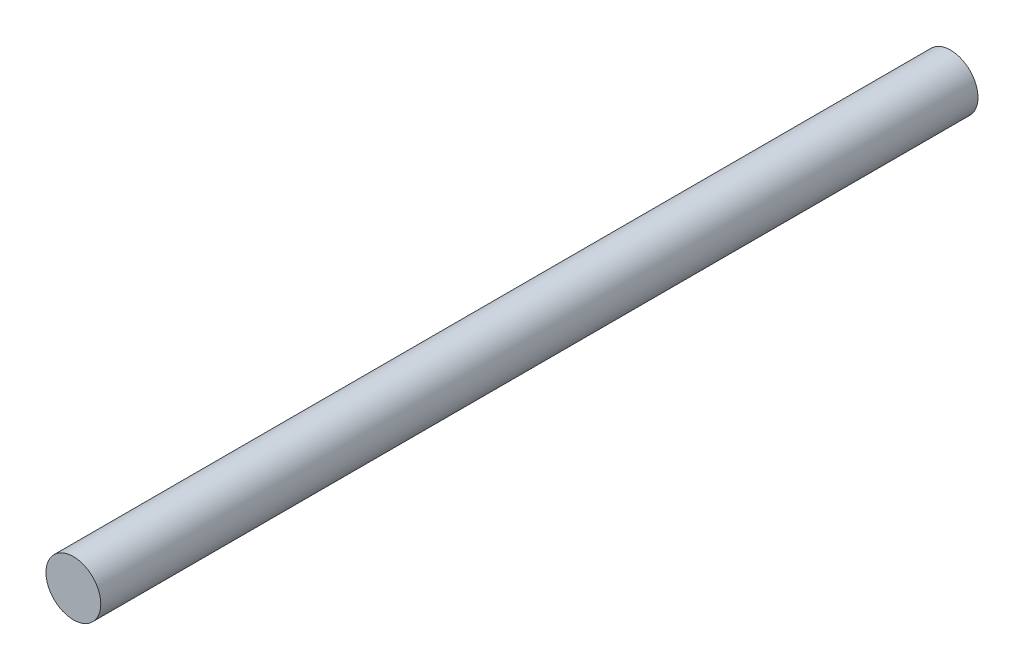
ISO-10303-21;
HEADER;
FILE_DESCRIPTION(('STEP AP214'),'2;1');
FILE_NAME('part.step','',(''),(''),'','','');
FILE_SCHEMA(('AUTOMOTIVE_DESIGN { 1 0 10303 214 1 1 1 1 }'));
ENDSEC;
DATA;
#1=APPLICATION_CONTEXT('core data for automotive mechanical design processes');
#2=APPLICATION_PROTOCOL_DEFINITION('international standard','automotive_design',2000,#1);
#3=PRODUCT_CONTEXT('',#1,'mechanical');
#4=PRODUCT('Part','Part','',(#3));
#5=PRODUCT_RELATED_PRODUCT_CATEGORY('part','',(#4));
#6=PRODUCT_DEFINITION_FORMATION('','',#4);
#7=PRODUCT_DEFINITION_CONTEXT('part definition',#1,'design');
#8=PRODUCT_DEFINITION('design','',#6,#7);
#9=PRODUCT_DEFINITION_SHAPE('','',#8);
#10=(LENGTH_UNIT() NAMED_UNIT(*) SI_UNIT(.MILLI.,.METRE.));
#11=(NAMED_UNIT(*) PLANE_ANGLE_UNIT() SI_UNIT($,.RADIAN.));
#12=(NAMED_UNIT(*) SI_UNIT($,.STERADIAN.) SOLID_ANGLE_UNIT());
#13=UNCERTAINTY_MEASURE_WITH_UNIT(LENGTH_MEASURE(1.E-05),#10,'distance_accuracy_value','');
#14=(GEOMETRIC_REPRESENTATION_CONTEXT(3) GLOBAL_UNCERTAINTY_ASSIGNED_CONTEXT((#13)) GLOBAL_UNIT_ASSIGNED_CONTEXT((#10,
#11,#12)) REPRESENTATION_CONTEXT('',''));
#15=CARTESIAN_POINT('',(0.,0.,0.));
#16=DIRECTION('',(0.,0.,1.));
#17=DIRECTION('',(1.,0.,0.));
#18=AXIS2_PLACEMENT_3D('',#15,#16,#17);
#19=CARTESIAN_POINT('',(0.,0.,76.2));
#20=DIRECTION('',(0.,0.,-1.));
#21=DIRECTION('',(-1.,0.,0.));
#22=AXIS2_PLACEMENT_3D('',#19,#20,#21);
#23=CYLINDRICAL_SURFACE('',#22,4.7625);
#24=CARTESIAN_POINT('',(0.,0.,76.2));
#25=DIRECTION('',(0.,0.,1.));
#26=DIRECTION('',(1.,0.,0.));
#27=AXIS2_PLACEMENT_3D('',#24,#25,#26);
#28=CIRCLE('',#27,4.7625);
#29=CARTESIAN_POINT('',(4.7625,0.,76.2));
#30=VERTEX_POINT('',#29);
#31=EDGE_CURVE('E10',#30,#30,#28,.T.);
#32=ORIENTED_EDGE('',*,*,#31,.F.);
#33=EDGE_LOOP('',(#32));
#34=FACE_BOUND('',#33,.T.);
#35=CARTESIAN_POINT('',(0.,0.,-76.2));
#36=DIRECTION('',(0.,0.,1.));
#37=DIRECTION('',(1.,0.,0.));
#38=AXIS2_PLACEMENT_3D('',#35,#36,#37);
#39=CIRCLE('',#38,4.7625);
#40=CARTESIAN_POINT('',(4.7625,0.,-76.2));
#41=VERTEX_POINT('',#40);
#42=EDGE_CURVE('E40',#41,#41,#39,.T.);
#43=ORIENTED_EDGE('',*,*,#42,.T.);
#44=EDGE_LOOP('',(#43));
#45=FACE_BOUND('',#44,.T.);
#46=ADVANCED_FACE('F34',(#34,#45),#23,.T.);
#47=CARTESIAN_POINT('',(0.,0.,76.2));
#48=DIRECTION('',(0.,0.,1.));
#49=DIRECTION('',(1.,0.,0.));
#50=AXIS2_PLACEMENT_3D('',#47,#48,#49);
#51=PLANE('',#50);
#52=ORIENTED_EDGE('',*,*,#31,.T.);
#53=EDGE_LOOP('',(#52));
#54=FACE_BOUND('',#53,.T.);
#55=ADVANCED_FACE('F49',(#54),#51,.T.);
#56=CARTESIAN_POINT('',(0.,0.,-76.2));
#57=DIRECTION('',(0.,0.,1.));
#58=DIRECTION('',(1.,0.,0.));
#59=AXIS2_PLACEMENT_3D('',#56,#57,#58);
#60=PLANE('',#59);
#61=ORIENTED_EDGE('',*,*,#42,.F.);
#62=EDGE_LOOP('',(#61));
#63=FACE_BOUND('',#62,.T.);
#64=ADVANCED_FACE('F47',(#63),#60,.F.);
#65=CLOSED_SHELL('',(#46,#55,#64));
#66=MANIFOLD_SOLID_BREP('B2',#65);
#67=ADVANCED_BREP_SHAPE_REPRESENTATION('',(#18,#66),#14);
#68=SHAPE_DEFINITION_REPRESENTATION(#9,#67);
ENDSEC;
END-ISO-10303-21;
